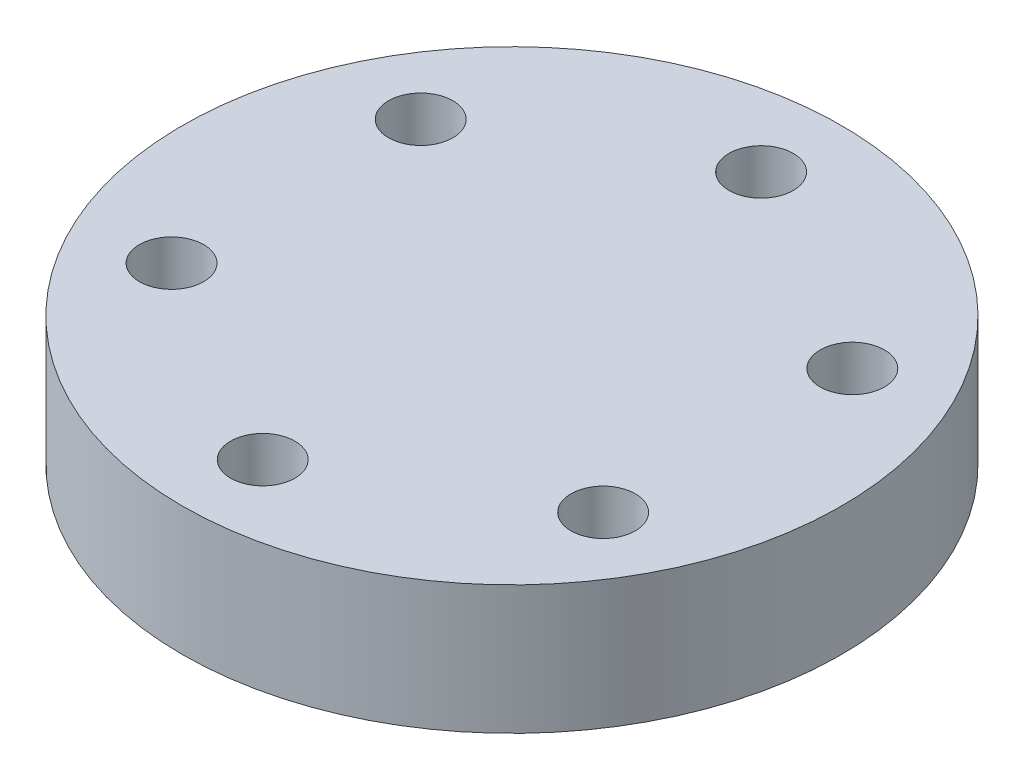
ISO-10303-21;
HEADER;
FILE_DESCRIPTION(('STEP AP214'),'2;1');
FILE_NAME('part.step','',(''),(''),'','','');
FILE_SCHEMA(('AUTOMOTIVE_DESIGN { 1 0 10303 214 1 1 1 1 }'));
ENDSEC;
DATA;
#1=APPLICATION_CONTEXT('core data for automotive mechanical design processes');
#2=APPLICATION_PROTOCOL_DEFINITION('international standard','automotive_design',2000,#1);
#3=PRODUCT_CONTEXT('',#1,'mechanical');
#4=PRODUCT('Part','Part','',(#3));
#5=PRODUCT_RELATED_PRODUCT_CATEGORY('part','',(#4));
#6=PRODUCT_DEFINITION_FORMATION('','',#4);
#7=PRODUCT_DEFINITION_CONTEXT('part definition',#1,'design');
#8=PRODUCT_DEFINITION('design','',#6,#7);
#9=PRODUCT_DEFINITION_SHAPE('','',#8);
#10=(LENGTH_UNIT() NAMED_UNIT(*) SI_UNIT(.MILLI.,.METRE.));
#11=(NAMED_UNIT(*) PLANE_ANGLE_UNIT() SI_UNIT($,.RADIAN.));
#12=(NAMED_UNIT(*) SI_UNIT($,.STERADIAN.) SOLID_ANGLE_UNIT());
#13=UNCERTAINTY_MEASURE_WITH_UNIT(LENGTH_MEASURE(1.E-05),#10,'distance_accuracy_value','');
#14=(GEOMETRIC_REPRESENTATION_CONTEXT(3) GLOBAL_UNCERTAINTY_ASSIGNED_CONTEXT((#13)) GLOBAL_UNIT_ASSIGNED_CONTEXT((#10,
#11,#12)) REPRESENTATION_CONTEXT('',''));
#15=CARTESIAN_POINT('',(0.,0.,0.));
#16=DIRECTION('',(0.,0.,1.));
#17=DIRECTION('',(1.,0.,0.));
#18=AXIS2_PLACEMENT_3D('',#15,#16,#17);
#19=CARTESIAN_POINT('',(0.,8.,0.));
#20=DIRECTION('',(0.,-1.,0.));
#21=DIRECTION('',(0.,0.,-1.));
#22=AXIS2_PLACEMENT_3D('',#19,#20,#21);
#23=CYLINDRICAL_SURFACE('',#22,20.5);
#24=CARTESIAN_POINT('',(0.,8.,0.));
#25=DIRECTION('',(0.,1.,0.));
#26=DIRECTION('',(0.,0.,1.));
#27=AXIS2_PLACEMENT_3D('',#24,#25,#26);
#28=CIRCLE('',#27,20.5);
#29=CARTESIAN_POINT('',(0.,8.,20.5));
#30=VERTEX_POINT('',#29);
#31=EDGE_CURVE('E10',#30,#30,#28,.T.);
#32=ORIENTED_EDGE('',*,*,#31,.F.);
#33=EDGE_LOOP('',(#32));
#34=FACE_BOUND('',#33,.T.);
#35=CARTESIAN_POINT('',(0.,0.,0.));
#36=DIRECTION('',(0.,1.,0.));
#37=DIRECTION('',(0.,0.,1.));
#38=AXIS2_PLACEMENT_3D('',#35,#36,#37);
#39=CIRCLE('',#38,20.5);
#40=CARTESIAN_POINT('',(0.,0.,20.5));
#41=VERTEX_POINT('',#40);
#42=EDGE_CURVE('E37',#41,#41,#39,.T.);
#43=ORIENTED_EDGE('',*,*,#42,.T.);
#44=EDGE_LOOP('',(#43));
#45=FACE_BOUND('',#44,.T.);
#46=ADVANCED_FACE('F34',(#34,#45),#23,.T.);
#47=CARTESIAN_POINT('',(0.,8.,0.));
#48=DIRECTION('',(0.,1.,0.));
#49=DIRECTION('',(0.,0.,1.));
#50=AXIS2_PLACEMENT_3D('',#47,#48,#49);
#51=PLANE('',#50);
#52=CARTESIAN_POINT('',(13.4233937586587,8.,-7.75000000000016));
#53=DIRECTION('',(0.,1.,0.));
#54=DIRECTION('',(-0.866025403784433,0.,0.50000000000001));
#55=AXIS2_PLACEMENT_3D('',#52,#53,#54);
#56=CIRCLE('',#55,2.);
#57=CARTESIAN_POINT('',(11.6913429510898,8.,-6.75000000000014));
#58=VERTEX_POINT('',#57);
#59=EDGE_CURVE('E62',#58,#58,#56,.T.);
#60=ORIENTED_EDGE('',*,*,#59,.F.);
#61=EDGE_LOOP('',(#60));
#62=FACE_BOUND('',#61,.T.);
#63=CARTESIAN_POINT('',(13.4233937586589,8.,7.74999999999987));
#64=DIRECTION('',(0.,1.,0.));
#65=DIRECTION('',(-0.866025403784443,0.,-0.499999999999992));
#66=AXIS2_PLACEMENT_3D('',#63,#64,#65);
#67=CIRCLE('',#66,2.);
#68=CARTESIAN_POINT('',(11.69134295109,8.,6.74999999999989));
#69=VERTEX_POINT('',#68);
#70=EDGE_CURVE('E61',#69,#69,#67,.T.);
#71=ORIENTED_EDGE('',*,*,#70,.F.);
#72=EDGE_LOOP('',(#71));
#73=FACE_BOUND('',#72,.T.);
#74=CARTESIAN_POINT('',(0.,8.,15.5));
#75=DIRECTION('',(0.,1.,0.));
#76=DIRECTION('',(0.,0.,-1.));
#77=AXIS2_PLACEMENT_3D('',#74,#75,#76);
#78=CIRCLE('',#77,2.);
#79=CARTESIAN_POINT('',(0.,8.,13.5));
#80=VERTEX_POINT('',#79);
#81=EDGE_CURVE('E68',#80,#80,#78,.T.);
#82=ORIENTED_EDGE('',*,*,#81,.F.);
#83=EDGE_LOOP('',(#82));
#84=FACE_BOUND('',#83,.T.);
#85=CARTESIAN_POINT('',(-13.4233937586588,8.,7.75000000000006));
#86=DIRECTION('',(0.,1.,0.));
#87=DIRECTION('',(0.866025403784436,0.,-0.500000000000004));
#88=AXIS2_PLACEMENT_3D('',#85,#86,#87);
#89=CIRCLE('',#88,2.);
#90=CARTESIAN_POINT('',(-11.6913429510899,8.,6.75000000000005));
#91=VERTEX_POINT('',#90);
#92=EDGE_CURVE('E74',#91,#91,#89,.T.);
#93=ORIENTED_EDGE('',*,*,#92,.F.);
#94=EDGE_LOOP('',(#93));
#95=FACE_BOUND('',#94,.T.);
#96=CARTESIAN_POINT('',(-13.4233937586588,8.,-7.74999999999997));
#97=DIRECTION('',(0.,1.,0.));
#98=DIRECTION('',(0.86602540378444,0.,0.499999999999998));
#99=AXIS2_PLACEMENT_3D('',#96,#97,#98);
#100=CIRCLE('',#99,2.);
#101=CARTESIAN_POINT('',(-11.6913429510899,8.,-6.74999999999997));
#102=VERTEX_POINT('',#101);
#103=EDGE_CURVE('E54',#102,#102,#100,.T.);
#104=ORIENTED_EDGE('',*,*,#103,.F.);
#105=EDGE_LOOP('',(#104));
#106=FACE_BOUND('',#105,.T.);
#107=CARTESIAN_POINT('',(0.,8.,-15.5));
#108=DIRECTION('',(0.,1.,0.));
#109=DIRECTION('',(0.,0.,1.));
#110=AXIS2_PLACEMENT_3D('',#107,#108,#109);
#111=CIRCLE('',#110,2.);
#112=CARTESIAN_POINT('',(0.,8.,-13.5));
#113=VERTEX_POINT('',#112);
#114=EDGE_CURVE('E48',#113,#113,#111,.T.);
#115=ORIENTED_EDGE('',*,*,#114,.F.);
#116=EDGE_LOOP('',(#115));
#117=FACE_BOUND('',#116,.T.);
#118=ORIENTED_EDGE('',*,*,#31,.T.);
#119=EDGE_LOOP('',(#118));
#120=FACE_BOUND('',#119,.T.);
#121=ADVANCED_FACE('F85',(#62,#73,#84,#95,#106,#117,#120),#51,.T.);
#122=CARTESIAN_POINT('',(0.,0.,0.));
#123=DIRECTION('',(0.,1.,0.));
#124=DIRECTION('',(0.,0.,1.));
#125=AXIS2_PLACEMENT_3D('',#122,#123,#124);
#126=PLANE('',#125);
#127=CARTESIAN_POINT('',(13.4233937586587,0.,-7.75000000000016));
#128=DIRECTION('',(0.,1.,0.));
#129=DIRECTION('',(0.,0.,1.));
#130=AXIS2_PLACEMENT_3D('',#127,#128,#129);
#131=CIRCLE('',#130,2.);
#132=CARTESIAN_POINT('',(13.4233937586587,0.,-5.75000000000016));
#133=VERTEX_POINT('',#132);
#134=EDGE_CURVE('E58',#133,#133,#131,.F.);
#135=ORIENTED_EDGE('',*,*,#134,.F.);
#136=EDGE_LOOP('',(#135));
#137=FACE_BOUND('',#136,.T.);
#138=CARTESIAN_POINT('',(13.4233937586589,0.,7.74999999999987));
#139=DIRECTION('',(0.,1.,0.));
#140=DIRECTION('',(0.,0.,1.));
#141=AXIS2_PLACEMENT_3D('',#138,#139,#140);
#142=CIRCLE('',#141,2.);
#143=CARTESIAN_POINT('',(13.4233937586589,0.,9.74999999999988));
#144=VERTEX_POINT('',#143);
#145=EDGE_CURVE('E65',#144,#144,#142,.F.);
#146=ORIENTED_EDGE('',*,*,#145,.F.);
#147=EDGE_LOOP('',(#146));
#148=FACE_BOUND('',#147,.T.);
#149=CARTESIAN_POINT('',(0.,0.,15.5));
#150=DIRECTION('',(0.,1.,0.));
#151=DIRECTION('',(0.,0.,1.));
#152=AXIS2_PLACEMENT_3D('',#149,#150,#151);
#153=CIRCLE('',#152,2.);
#154=CARTESIAN_POINT('',(0.,0.,17.5));
#155=VERTEX_POINT('',#154);
#156=EDGE_CURVE('E71',#155,#155,#153,.F.);
#157=ORIENTED_EDGE('',*,*,#156,.F.);
#158=EDGE_LOOP('',(#157));
#159=FACE_BOUND('',#158,.T.);
#160=CARTESIAN_POINT('',(-13.4233937586588,0.,7.75000000000006));
#161=DIRECTION('',(0.,1.,0.));
#162=DIRECTION('',(0.,0.,1.));
#163=AXIS2_PLACEMENT_3D('',#160,#161,#162);
#164=CIRCLE('',#163,2.);
#165=CARTESIAN_POINT('',(-13.4233937586588,0.,9.75000000000006));
#166=VERTEX_POINT('',#165);
#167=EDGE_CURVE('E57',#166,#166,#164,.F.);
#168=ORIENTED_EDGE('',*,*,#167,.F.);
#169=EDGE_LOOP('',(#168));
#170=FACE_BOUND('',#169,.T.);
#171=CARTESIAN_POINT('',(-13.4233937586588,0.,-7.74999999999997));
#172=DIRECTION('',(0.,1.,0.));
#173=DIRECTION('',(0.,0.,1.));
#174=AXIS2_PLACEMENT_3D('',#171,#172,#173);
#175=CIRCLE('',#174,2.);
#176=CARTESIAN_POINT('',(-13.4233937586588,0.,-5.74999999999997));
#177=VERTEX_POINT('',#176);
#178=EDGE_CURVE('E51',#177,#177,#175,.F.);
#179=ORIENTED_EDGE('',*,*,#178,.F.);
#180=EDGE_LOOP('',(#179));
#181=FACE_BOUND('',#180,.T.);
#182=CARTESIAN_POINT('',(0.,0.,-15.5));
#183=DIRECTION('',(0.,1.,0.));
#184=DIRECTION('',(0.,0.,1.));
#185=AXIS2_PLACEMENT_3D('',#182,#183,#184);
#186=CIRCLE('',#185,2.);
#187=CARTESIAN_POINT('',(0.,0.,-13.5));
#188=VERTEX_POINT('',#187);
#189=EDGE_CURVE('E44',#188,#188,#186,.F.);
#190=ORIENTED_EDGE('',*,*,#189,.F.);
#191=EDGE_LOOP('',(#190));
#192=FACE_BOUND('',#191,.T.);
#193=ORIENTED_EDGE('',*,*,#42,.F.);
#194=EDGE_LOOP('',(#193));
#195=FACE_BOUND('',#194,.T.);
#196=ADVANCED_FACE('F88',(#137,#148,#159,#170,#181,#192,#195),#126,.F.);
#197=CARTESIAN_POINT('',(0.,-0.000999999999999265,-15.5));
#198=DIRECTION('',(0.,1.,0.));
#199=DIRECTION('',(0.,0.,1.));
#200=AXIS2_PLACEMENT_3D('',#197,#198,#199);
#201=CYLINDRICAL_SURFACE('',#200,2.);
#202=ORIENTED_EDGE('',*,*,#114,.T.);
#203=EDGE_LOOP('',(#202));
#204=FACE_BOUND('',#203,.T.);
#205=ORIENTED_EDGE('',*,*,#189,.T.);
#206=EDGE_LOOP('',(#205));
#207=FACE_BOUND('',#206,.T.);
#208=ADVANCED_FACE('F95',(#204,#207),#201,.F.);
#209=CARTESIAN_POINT('',(-13.4233937586588,-0.000999999999999265,-7.74999999999997));
#210=DIRECTION('',(0.,1.,0.));
#211=DIRECTION('',(0.,0.,1.));
#212=AXIS2_PLACEMENT_3D('',#209,#210,#211);
#213=CYLINDRICAL_SURFACE('',#212,2.);
#214=ORIENTED_EDGE('',*,*,#103,.T.);
#215=EDGE_LOOP('',(#214));
#216=FACE_BOUND('',#215,.T.);
#217=ORIENTED_EDGE('',*,*,#178,.T.);
#218=EDGE_LOOP('',(#217));
#219=FACE_BOUND('',#218,.T.);
#220=ADVANCED_FACE('F98',(#216,#219),#213,.F.);
#221=CARTESIAN_POINT('',(-13.4233937586588,-0.000999999999999265,7.75000000000006));
#222=DIRECTION('',(0.,1.,0.));
#223=DIRECTION('',(0.,0.,1.));
#224=AXIS2_PLACEMENT_3D('',#221,#222,#223);
#225=CYLINDRICAL_SURFACE('',#224,2.);
#226=ORIENTED_EDGE('',*,*,#92,.T.);
#227=EDGE_LOOP('',(#226));
#228=FACE_BOUND('',#227,.T.);
#229=ORIENTED_EDGE('',*,*,#167,.T.);
#230=EDGE_LOOP('',(#229));
#231=FACE_BOUND('',#230,.T.);
#232=ADVANCED_FACE('F82',(#228,#231),#225,.F.);
#233=CARTESIAN_POINT('',(0.,-0.000999999999999265,15.5));
#234=DIRECTION('',(0.,1.,0.));
#235=DIRECTION('',(0.,0.,1.));
#236=AXIS2_PLACEMENT_3D('',#233,#234,#235);
#237=CYLINDRICAL_SURFACE('',#236,2.);
#238=ORIENTED_EDGE('',*,*,#81,.T.);
#239=EDGE_LOOP('',(#238));
#240=FACE_BOUND('',#239,.T.);
#241=ORIENTED_EDGE('',*,*,#156,.T.);
#242=EDGE_LOOP('',(#241));
#243=FACE_BOUND('',#242,.T.);
#244=ADVANCED_FACE('F136',(#240,#243),#237,.F.);
#245=CARTESIAN_POINT('',(13.4233937586589,-0.000999999999999265,7.74999999999987));
#246=DIRECTION('',(0.,1.,0.));
#247=DIRECTION('',(0.,0.,1.));
#248=AXIS2_PLACEMENT_3D('',#245,#246,#247);
#249=CYLINDRICAL_SURFACE('',#248,2.);
#250=ORIENTED_EDGE('',*,*,#70,.T.);
#251=EDGE_LOOP('',(#250));
#252=FACE_BOUND('',#251,.T.);
#253=ORIENTED_EDGE('',*,*,#145,.T.);
#254=EDGE_LOOP('',(#253));
#255=FACE_BOUND('',#254,.T.);
#256=ADVANCED_FACE('F143',(#252,#255),#249,.F.);
#257=CARTESIAN_POINT('',(13.4233937586587,-0.000999999999999265,-7.75000000000016));
#258=DIRECTION('',(0.,1.,0.));
#259=DIRECTION('',(0.,0.,1.));
#260=AXIS2_PLACEMENT_3D('',#257,#258,#259);
#261=CYLINDRICAL_SURFACE('',#260,2.);
#262=ORIENTED_EDGE('',*,*,#59,.T.);
#263=EDGE_LOOP('',(#262));
#264=FACE_BOUND('',#263,.T.);
#265=ORIENTED_EDGE('',*,*,#134,.T.);
#266=EDGE_LOOP('',(#265));
#267=FACE_BOUND('',#266,.T.);
#268=ADVANCED_FACE('F151',(#264,#267),#261,.F.);
#269=CLOSED_SHELL('',(#46,#121,#196,#208,#220,#232,#244,#256,#268));
#270=MANIFOLD_SOLID_BREP('B2',#269);
#271=ADVANCED_BREP_SHAPE_REPRESENTATION('',(#18,#270),#14);
#272=SHAPE_DEFINITION_REPRESENTATION(#9,#271);
ENDSEC;
END-ISO-10303-21;
